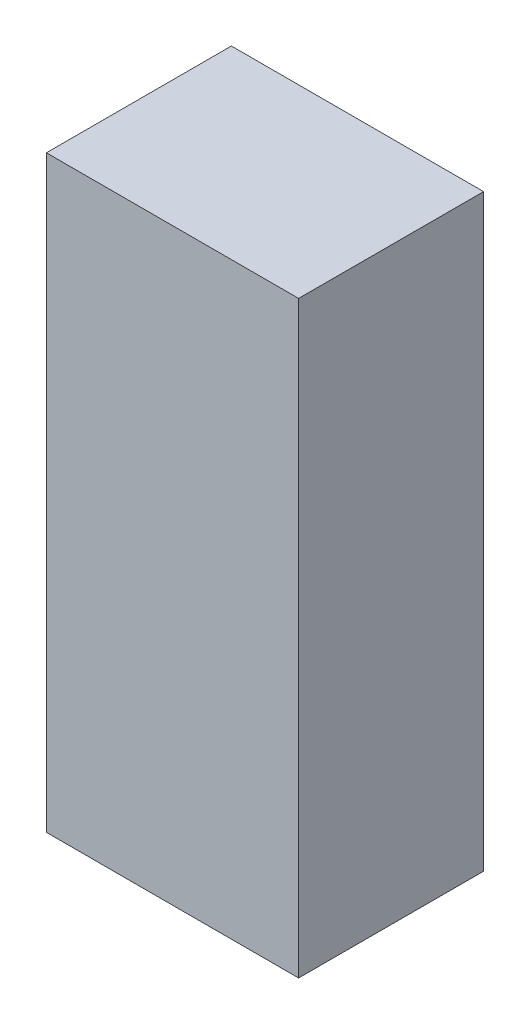
ISO-10303-21;
HEADER;
FILE_DESCRIPTION(('STEP AP214'),'2;1');
FILE_NAME('part.step','',(''),(''),'','','');
FILE_SCHEMA(('AUTOMOTIVE_DESIGN { 1 0 10303 214 1 1 1 1 }'));
ENDSEC;
DATA;
#1=APPLICATION_CONTEXT('core data for automotive mechanical design processes');
#2=APPLICATION_PROTOCOL_DEFINITION('international standard','automotive_design',2000,#1);
#3=PRODUCT_CONTEXT('',#1,'mechanical');
#4=PRODUCT('Part','Part','',(#3));
#5=PRODUCT_RELATED_PRODUCT_CATEGORY('part','',(#4));
#6=PRODUCT_DEFINITION_FORMATION('','',#4);
#7=PRODUCT_DEFINITION_CONTEXT('part definition',#1,'design');
#8=PRODUCT_DEFINITION('design','',#6,#7);
#9=PRODUCT_DEFINITION_SHAPE('','',#8);
#10=(LENGTH_UNIT() NAMED_UNIT(*) SI_UNIT(.MILLI.,.METRE.));
#11=(NAMED_UNIT(*) PLANE_ANGLE_UNIT() SI_UNIT($,.RADIAN.));
#12=(NAMED_UNIT(*) SI_UNIT($,.STERADIAN.) SOLID_ANGLE_UNIT());
#13=UNCERTAINTY_MEASURE_WITH_UNIT(LENGTH_MEASURE(1.E-05),#10,'distance_accuracy_value','');
#14=(GEOMETRIC_REPRESENTATION_CONTEXT(3) GLOBAL_UNCERTAINTY_ASSIGNED_CONTEXT((#13)) GLOBAL_UNIT_ASSIGNED_CONTEXT((#10,
#11,#12)) REPRESENTATION_CONTEXT('',''));
#15=CARTESIAN_POINT('',(0.,0.,0.));
#16=DIRECTION('',(0.,0.,1.));
#17=DIRECTION('',(1.,0.,0.));
#18=AXIS2_PLACEMENT_3D('',#15,#16,#17);
#19=CARTESIAN_POINT('',(30.01,70.0099999999999,-850.));
#20=DIRECTION('',(0.,0.,-1.));
#21=DIRECTION('',(0.,-1.,0.));
#22=AXIS2_PLACEMENT_3D('',#19,#20,#21);
#23=PLANE('',#22);
#24=DIRECTION('',(0.,1.,0.));
#25=VECTOR('',#24,1.);
#26=CARTESIAN_POINT('',(30.,34.9999999999999,-850.));
#27=LINE('',#26,#25);
#28=CARTESIAN_POINT('',(30.,-1.05428759459062E-13,-850.));
#29=VERTEX_POINT('',#28);
#30=CARTESIAN_POINT('',(30.,69.9999999999999,-850.));
#31=VERTEX_POINT('',#30);
#32=EDGE_CURVE('E69',#29,#31,#27,.T.);
#33=ORIENTED_EDGE('',*,*,#32,.F.);
#34=DIRECTION('',(1.,0.,0.));
#35=VECTOR('',#34,1.);
#36=CARTESIAN_POINT('',(15.,-1.06581410364015E-13,-850.));
#37=LINE('',#36,#35);
#38=CARTESIAN_POINT('',(0.,-1.07408885320517E-13,-850.));
#39=VERTEX_POINT('',#38);
#40=EDGE_CURVE('E56',#39,#29,#37,.T.);
#41=ORIENTED_EDGE('',*,*,#40,.F.);
#42=DIRECTION('',(0.,-1.,0.));
#43=VECTOR('',#42,1.);
#44=CARTESIAN_POINT('',(0.,34.9999999999999,-850.));
#45=LINE('',#44,#43);
#46=CARTESIAN_POINT('',(0.,69.9999999999999,-850.));
#47=VERTEX_POINT('',#46);
#48=EDGE_CURVE('E21',#47,#39,#45,.T.);
#49=ORIENTED_EDGE('',*,*,#48,.F.);
#50=DIRECTION('',(-1.,0.,0.));
#51=VECTOR('',#50,1.);
#52=CARTESIAN_POINT('',(15.,69.9999999999999,-850.));
#53=LINE('',#52,#51);
#54=EDGE_CURVE('E82',#31,#47,#53,.T.);
#55=ORIENTED_EDGE('',*,*,#54,.F.);
#56=EDGE_LOOP('',(#33,#41,#49,#55));
#57=FACE_BOUND('',#56,.T.);
#58=ADVANCED_FACE('F17',(#57),#23,.T.);
#59=CARTESIAN_POINT('',(0.,-0.0100000000001055,-850.01));
#60=DIRECTION('',(-1.,0.,0.));
#61=DIRECTION('',(0.,0.,1.));
#62=AXIS2_PLACEMENT_3D('',#59,#60,#61);
#63=PLANE('',#62);
#64=DIRECTION('',(0.,-1.,0.));
#65=VECTOR('',#64,1.);
#66=CARTESIAN_POINT('',(0.,34.9999999999999,-828.));
#67=LINE('',#66,#65);
#68=CARTESIAN_POINT('',(0.,69.9999999999999,-828.));
#69=VERTEX_POINT('',#68);
#70=CARTESIAN_POINT('',(0.,-1.04610345462555E-13,-828.));
#71=VERTEX_POINT('',#70);
#72=EDGE_CURVE('E84',#69,#71,#67,.T.);
#73=ORIENTED_EDGE('',*,*,#72,.F.);
#74=DIRECTION('',(0.,0.,1.));
#75=VECTOR('',#74,1.);
#76=CARTESIAN_POINT('',(0.,69.9999999999999,-839.));
#77=LINE('',#76,#75);
#78=EDGE_CURVE('E65',#47,#69,#77,.T.);
#79=ORIENTED_EDGE('',*,*,#78,.F.);
#80=ORIENTED_EDGE('',*,*,#48,.T.);
#81=DIRECTION('',(0.,0.,-1.));
#82=VECTOR('',#81,1.);
#83=CARTESIAN_POINT('',(0.,-1.05195778461839E-13,-839.));
#84=LINE('',#83,#82);
#85=EDGE_CURVE('E62',#71,#39,#84,.T.);
#86=ORIENTED_EDGE('',*,*,#85,.F.);
#87=EDGE_LOOP('',(#73,#79,#80,#86));
#88=FACE_BOUND('',#87,.T.);
#89=ADVANCED_FACE('F61',(#88),#63,.T.);
#90=CARTESIAN_POINT('',(30.01,-1.06582670029381E-13,-850.01));
#91=DIRECTION('',(0.,-1.,0.));
#92=DIRECTION('',(0.,0.,1.));
#93=AXIS2_PLACEMENT_3D('',#90,#91,#92);
#94=PLANE('',#93);
#95=DIRECTION('',(0.,0.,-1.));
#96=VECTOR('',#95,1.);
#97=CARTESIAN_POINT('',(30.,-1.02158949702447E-13,-839.));
#98=LINE('',#97,#96);
#99=CARTESIAN_POINT('',(30.,-1.03672127125989E-13,-828.));
#100=VERTEX_POINT('',#99);
#101=EDGE_CURVE('E71',#100,#29,#98,.T.);
#102=ORIENTED_EDGE('',*,*,#101,.F.);
#103=DIRECTION('',(1.,0.,0.));
#104=VECTOR('',#103,1.);
#105=CARTESIAN_POINT('',(15.,-1.03810663949593E-13,-828.));
#106=LINE('',#105,#104);
#107=EDGE_CURVE('E75',#71,#100,#106,.T.);
#108=ORIENTED_EDGE('',*,*,#107,.F.);
#109=ORIENTED_EDGE('',*,*,#85,.T.);
#110=ORIENTED_EDGE('',*,*,#40,.T.);
#111=EDGE_LOOP('',(#102,#108,#109,#110));
#112=FACE_BOUND('',#111,.T.);
#113=ADVANCED_FACE('F73',(#112),#94,.T.);
#114=CARTESIAN_POINT('',(30.,-0.0100000000001055,-827.99));
#115=DIRECTION('',(1.,0.,0.));
#116=DIRECTION('',(0.,0.,-1.));
#117=AXIS2_PLACEMENT_3D('',#114,#115,#116);
#118=PLANE('',#117);
#119=DIRECTION('',(0.,0.,-1.));
#120=VECTOR('',#119,1.);
#121=CARTESIAN_POINT('',(30.,69.9999999999999,-839.));
#122=LINE('',#121,#120);
#123=CARTESIAN_POINT('',(30.,69.9999999999999,-828.));
#124=VERTEX_POINT('',#123);
#125=EDGE_CURVE('E36',#124,#31,#122,.T.);
#126=ORIENTED_EDGE('',*,*,#125,.F.);
#127=DIRECTION('',(0.,1.,0.));
#128=VECTOR('',#127,1.);
#129=CARTESIAN_POINT('',(30.,34.9999999999999,-828.));
#130=LINE('',#129,#128);
#131=EDGE_CURVE('E27',#100,#124,#130,.T.);
#132=ORIENTED_EDGE('',*,*,#131,.F.);
#133=ORIENTED_EDGE('',*,*,#101,.T.);
#134=ORIENTED_EDGE('',*,*,#32,.T.);
#135=EDGE_LOOP('',(#126,#132,#133,#134));
#136=FACE_BOUND('',#135,.T.);
#137=ADVANCED_FACE('F89',(#136),#118,.T.);
#138=CARTESIAN_POINT('',(30.01,69.9999999999999,-827.99));
#139=DIRECTION('',(0.,1.,0.));
#140=DIRECTION('',(0.,0.,-1.));
#141=AXIS2_PLACEMENT_3D('',#138,#139,#140);
#142=PLANE('',#141);
#143=ORIENTED_EDGE('',*,*,#125,.T.);
#144=ORIENTED_EDGE('',*,*,#54,.T.);
#145=ORIENTED_EDGE('',*,*,#78,.T.);
#146=DIRECTION('',(-1.,0.,0.));
#147=VECTOR('',#146,1.);
#148=CARTESIAN_POINT('',(15.,69.9999999999999,-828.));
#149=LINE('',#148,#147);
#150=EDGE_CURVE('E11',#124,#69,#149,.T.);
#151=ORIENTED_EDGE('',*,*,#150,.F.);
#152=EDGE_LOOP('',(#143,#144,#145,#151));
#153=FACE_BOUND('',#152,.T.);
#154=ADVANCED_FACE('F91',(#153),#142,.T.);
#155=CARTESIAN_POINT('',(30.01,-0.0100000000001066,-828.));
#156=DIRECTION('',(0.,0.,1.));
#157=DIRECTION('',(0.,1.,0.));
#158=AXIS2_PLACEMENT_3D('',#155,#156,#157);
#159=PLANE('',#158);
#160=ORIENTED_EDGE('',*,*,#131,.T.);
#161=ORIENTED_EDGE('',*,*,#150,.T.);
#162=ORIENTED_EDGE('',*,*,#72,.T.);
#163=ORIENTED_EDGE('',*,*,#107,.T.);
#164=EDGE_LOOP('',(#160,#161,#162,#163));
#165=FACE_BOUND('',#164,.T.);
#166=ADVANCED_FACE('F19',(#165),#159,.T.);
#167=CLOSED_SHELL('',(#58,#89,#113,#137,#154,#166));
#168=MANIFOLD_SOLID_BREP('B1',#167);
#169=ADVANCED_BREP_SHAPE_REPRESENTATION('',(#18,#168),#14);
#170=SHAPE_DEFINITION_REPRESENTATION(#9,#169);
ENDSEC;
END-ISO-10303-21;
